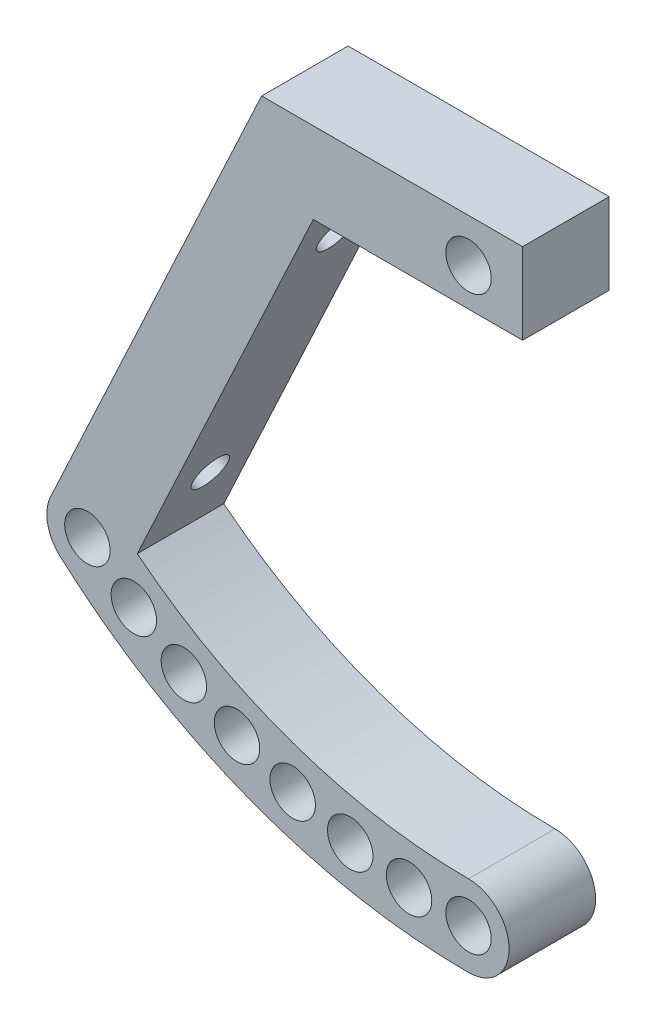
ISO-10303-21;
HEADER;
FILE_DESCRIPTION(('STEP AP214'),'2;1');
FILE_NAME('part.step','',(''),(''),'','','');
FILE_SCHEMA(('AUTOMOTIVE_DESIGN { 1 0 10303 214 1 1 1 1 }'));
ENDSEC;
DATA;
#1=APPLICATION_CONTEXT('core data for automotive mechanical design processes');
#2=APPLICATION_PROTOCOL_DEFINITION('international standard','automotive_design',2000,#1);
#3=PRODUCT_CONTEXT('',#1,'mechanical');
#4=PRODUCT('Part','Part','',(#3));
#5=PRODUCT_RELATED_PRODUCT_CATEGORY('part','',(#4));
#6=PRODUCT_DEFINITION_FORMATION('','',#4);
#7=PRODUCT_DEFINITION_CONTEXT('part definition',#1,'design');
#8=PRODUCT_DEFINITION('design','',#6,#7);
#9=PRODUCT_DEFINITION_SHAPE('','',#8);
#10=(LENGTH_UNIT() NAMED_UNIT(*) SI_UNIT(.MILLI.,.METRE.));
#11=(NAMED_UNIT(*) PLANE_ANGLE_UNIT() SI_UNIT($,.RADIAN.));
#12=(NAMED_UNIT(*) SI_UNIT($,.STERADIAN.) SOLID_ANGLE_UNIT());
#13=UNCERTAINTY_MEASURE_WITH_UNIT(LENGTH_MEASURE(1.E-05),#10,'distance_accuracy_value','');
#14=(GEOMETRIC_REPRESENTATION_CONTEXT(3) GLOBAL_UNCERTAINTY_ASSIGNED_CONTEXT((#13)) GLOBAL_UNIT_ASSIGNED_CONTEXT((#10,
#11,#12)) REPRESENTATION_CONTEXT('',''));
#15=CARTESIAN_POINT('',(0.,0.,0.));
#16=DIRECTION('',(0.,0.,1.));
#17=DIRECTION('',(1.,0.,0.));
#18=AXIS2_PLACEMENT_3D('',#15,#16,#17);
#19=CARTESIAN_POINT('',(-46.3566792332797,21.616474533113,8.));
#20=DIRECTION('',(0.906307787036651,-0.422618261740697,0.));
#21=DIRECTION('',(0.422618261740697,0.906307787036651,0.));
#22=AXIS2_PLACEMENT_3D('',#19,#20,#21);
#23=PLANE('',#22);
#24=CARTESIAN_POINT('',(-23.094691175394,71.5019689080599,4.));
#25=DIRECTION('',(-0.906307787036651,0.422618261740697,0.));
#26=DIRECTION('',(-0.422618261740697,-0.906307787036651,0.));
#27=AXIS2_PLACEMENT_3D('',#24,#25,#26);
#28=CIRCLE('',#27,1.65);
#29=CARTESIAN_POINT('',(-23.7920113072661,70.0065610594495,4.));
#30=VERTEX_POINT('',#29);
#31=EDGE_CURVE('E174',#30,#30,#28,.T.);
#32=ORIENTED_EDGE('',*,*,#31,.F.);
#33=EDGE_LOOP('',(#32));
#34=FACE_BOUND('',#33,.T.);
#35=CARTESIAN_POINT('',(-34.6744315470891,46.6691355432557,4.));
#36=DIRECTION('',(-0.906307787036651,0.422618261740697,0.));
#37=DIRECTION('',(-0.422618261740697,-0.906307787036651,0.));
#38=AXIS2_PLACEMENT_3D('',#35,#36,#37);
#39=CIRCLE('',#38,1.65);
#40=CARTESIAN_POINT('',(-35.3717516789612,45.1737276946452,4.));
#41=VERTEX_POINT('',#40);
#42=EDGE_CURVE('E257',#41,#41,#39,.T.);
#43=ORIENTED_EDGE('',*,*,#42,.F.);
#44=EDGE_LOOP('',(#43));
#45=FACE_BOUND('',#44,.T.);
#46=DIRECTION('',(-0.422618261740697,-0.906307787036651,0.));
#47=VECTOR('',#46,1.);
#48=CARTESIAN_POINT('',(-46.3566792332797,21.616474533113,0.));
#49=LINE('',#48,#47);
#50=CARTESIAN_POINT('',(-19.131994197983,80.,0.));
#51=VERTEX_POINT('',#50);
#52=CARTESIAN_POINT('',(-38.6371285245,38.1711044513156,0.));
#53=VERTEX_POINT('',#52);
#54=EDGE_CURVE('E173',#51,#53,#49,.T.);
#55=ORIENTED_EDGE('',*,*,#54,.T.);
#56=DIRECTION('',(0.,0.,-1.));
#57=VECTOR('',#56,1.);
#58=CARTESIAN_POINT('',(-38.6371285245,38.1711044513156,8.));
#59=LINE('',#58,#57);
#60=CARTESIAN_POINT('',(-38.6371285245,38.1711044513156,8.));
#61=VERTEX_POINT('',#60);
#62=EDGE_CURVE('E11',#61,#53,#59,.T.);
#63=ORIENTED_EDGE('',*,*,#62,.F.);
#64=DIRECTION('',(-0.422618261740697,-0.906307787036651,0.));
#65=VECTOR('',#64,1.);
#66=CARTESIAN_POINT('',(-46.3566792332797,21.616474533113,8.));
#67=LINE('',#66,#65);
#68=CARTESIAN_POINT('',(-19.131994197983,80.,8.));
#69=VERTEX_POINT('',#68);
#70=EDGE_CURVE('E250',#69,#61,#67,.T.);
#71=ORIENTED_EDGE('',*,*,#70,.F.);
#72=DIRECTION('',(0.,0.,-1.));
#73=VECTOR('',#72,1.);
#74=CARTESIAN_POINT('',(-19.131994197983,80.,8.));
#75=LINE('',#74,#73);
#76=EDGE_CURVE('E169',#69,#51,#75,.T.);
#77=ORIENTED_EDGE('',*,*,#76,.T.);
#78=EDGE_LOOP('',(#55,#63,#71,#77));
#79=FACE_BOUND('',#78,.T.);
#80=ADVANCED_FACE('F40',(#34,#45,#79),#23,.F.);
#81=CARTESIAN_POINT('',(-35.2384743231125,36.586285969788,8.));
#82=DIRECTION('',(0.,0.,-1.));
#83=DIRECTION('',(-1.,0.,0.));
#84=AXIS2_PLACEMENT_3D('',#81,#82,#83);
#85=CYLINDRICAL_SURFACE('',#84,3.75);
#86=CARTESIAN_POINT('',(-35.2384743231125,36.586285969788,0.));
#87=DIRECTION('',(0.,0.,1.));
#88=DIRECTION('',(1.,0.,0.));
#89=AXIS2_PLACEMENT_3D('',#86,#87,#88);
#90=CIRCLE('',#89,3.75);
#91=CARTESIAN_POINT('',(-37.7379138053234,33.7906997567076,0.));
#92=VERTEX_POINT('',#91);
#93=EDGE_CURVE('E177',#53,#92,#90,.T.);
#94=ORIENTED_EDGE('',*,*,#93,.T.);
#95=DIRECTION('',(0.,0.,-1.));
#96=VECTOR('',#95,1.);
#97=CARTESIAN_POINT('',(-37.7379138053234,33.7906997567076,8.));
#98=LINE('',#97,#96);
#99=CARTESIAN_POINT('',(-37.7379138053234,33.7906997567076,8.));
#100=VERTEX_POINT('',#99);
#101=EDGE_CURVE('E49',#100,#92,#98,.T.);
#102=ORIENTED_EDGE('',*,*,#101,.F.);
#103=CARTESIAN_POINT('',(-35.2384743231125,36.586285969788,8.));
#104=DIRECTION('',(0.,0.,1.));
#105=DIRECTION('',(1.,0.,0.));
#106=AXIS2_PLACEMENT_3D('',#103,#104,#105);
#107=CIRCLE('',#106,3.75);
#108=EDGE_CURVE('E102',#61,#100,#107,.T.);
#109=ORIENTED_EDGE('',*,*,#108,.F.);
#110=ORIENTED_EDGE('',*,*,#62,.T.);
#111=EDGE_LOOP('',(#94,#102,#109,#110));
#112=FACE_BOUND('',#111,.T.);
#113=ADVANCED_FACE('F270',(#112),#85,.T.);
#114=CARTESIAN_POINT('',(0.,76.,8.));
#115=DIRECTION('',(0.,0.,-1.));
#116=DIRECTION('',(-1.,0.,0.));
#117=AXIS2_PLACEMENT_3D('',#114,#115,#116);
#118=CYLINDRICAL_SURFACE('',#117,56.6195652173913);
#119=CARTESIAN_POINT('',(0.,76.,0.));
#120=DIRECTION('',(0.,0.,1.));
#121=DIRECTION('',(1.,0.,0.));
#122=AXIS2_PLACEMENT_3D('',#119,#120,#121);
#123=CIRCLE('',#122,56.6195652173913);
#124=CARTESIAN_POINT('',(-6.22100093414468E-13,19.3804347826087,0.));
#125=VERTEX_POINT('',#124);
#126=EDGE_CURVE('E179',#92,#125,#123,.T.);
#127=ORIENTED_EDGE('',*,*,#126,.T.);
#128=DIRECTION('',(0.,0.,-1.));
#129=VECTOR('',#128,1.);
#130=CARTESIAN_POINT('',(-6.22100093414468E-13,19.3804347826087,8.));
#131=LINE('',#130,#129);
#132=CARTESIAN_POINT('',(-6.22100093414468E-13,19.3804347826087,8.));
#133=VERTEX_POINT('',#132);
#134=EDGE_CURVE('E225',#133,#125,#131,.T.);
#135=ORIENTED_EDGE('',*,*,#134,.F.);
#136=CARTESIAN_POINT('',(0.,76.,8.));
#137=DIRECTION('',(0.,0.,1.));
#138=DIRECTION('',(1.,0.,0.));
#139=AXIS2_PLACEMENT_3D('',#136,#137,#138);
#140=CIRCLE('',#139,56.6195652173913);
#141=EDGE_CURVE('E233',#100,#133,#140,.T.);
#142=ORIENTED_EDGE('',*,*,#141,.F.);
#143=ORIENTED_EDGE('',*,*,#101,.T.);
#144=EDGE_LOOP('',(#127,#135,#142,#143));
#145=FACE_BOUND('',#144,.T.);
#146=ADVANCED_FACE('F231',(#145),#118,.T.);
#147=CARTESIAN_POINT('',(-5.50774703622636E-13,23.1304347826087,8.));
#148=DIRECTION('',(0.,0.,-1.));
#149=DIRECTION('',(-1.,0.,0.));
#150=AXIS2_PLACEMENT_3D('',#147,#148,#149);
#151=CYLINDRICAL_SURFACE('',#150,3.74999999999999);
#152=CARTESIAN_POINT('',(-5.50774703622636E-13,23.1304347826087,0.));
#153=DIRECTION('',(0.,0.,1.));
#154=DIRECTION('',(1.,0.,0.));
#155=AXIS2_PLACEMENT_3D('',#152,#153,#154);
#156=CIRCLE('',#155,3.74999999999999);
#157=CARTESIAN_POINT('',(-5.40786307992416E-13,26.8804347826087,0.));
#158=VERTEX_POINT('',#157);
#159=EDGE_CURVE('E181',#125,#158,#156,.T.);
#160=ORIENTED_EDGE('',*,*,#159,.T.);
#161=DIRECTION('',(0.,0.,-1.));
#162=VECTOR('',#161,1.);
#163=CARTESIAN_POINT('',(-5.40786307992416E-13,26.8804347826087,8.));
#164=LINE('',#163,#162);
#165=CARTESIAN_POINT('',(-5.40786307992416E-13,26.8804347826087,8.));
#166=VERTEX_POINT('',#165);
#167=EDGE_CURVE('E223',#166,#158,#164,.T.);
#168=ORIENTED_EDGE('',*,*,#167,.F.);
#169=CARTESIAN_POINT('',(-5.50774703622636E-13,23.1304347826087,8.));
#170=DIRECTION('',(0.,0.,1.));
#171=DIRECTION('',(1.,0.,0.));
#172=AXIS2_PLACEMENT_3D('',#169,#170,#171);
#173=CIRCLE('',#172,3.74999999999999);
#174=EDGE_CURVE('E245',#133,#166,#173,.T.);
#175=ORIENTED_EDGE('',*,*,#174,.F.);
#176=ORIENTED_EDGE('',*,*,#134,.T.);
#177=EDGE_LOOP('',(#160,#168,#175,#176));
#178=FACE_BOUND('',#177,.T.);
#179=ADVANCED_FACE('F242',(#178),#151,.T.);
#180=CARTESIAN_POINT('',(0.,76.,8.));
#181=DIRECTION('',(0.,0.,-1.));
#182=DIRECTION('',(-1.,0.,0.));
#183=AXIS2_PLACEMENT_3D('',#180,#181,#182);
#184=CYLINDRICAL_SURFACE('',#183,49.1195652173913);
#185=CARTESIAN_POINT('',(0.,76.,0.));
#186=DIRECTION('',(0.,0.,1.));
#187=DIRECTION('',(1.,0.,0.));
#188=AXIS2_PLACEMENT_3D('',#185,#186,#187);
#189=CIRCLE('',#188,49.1195652173913);
#190=CARTESIAN_POINT('',(-30.6285068063964,37.5991372758881,0.));
#191=VERTEX_POINT('',#190);
#192=EDGE_CURVE('E184',#191,#158,#189,.T.);
#193=ORIENTED_EDGE('',*,*,#192,.F.);
#194=DIRECTION('',(0.,0.,-1.));
#195=VECTOR('',#194,1.);
#196=CARTESIAN_POINT('',(-30.6285068063964,37.5991372758881,8.));
#197=LINE('',#196,#195);
#198=CARTESIAN_POINT('',(-30.6285068063964,37.5991372758881,8.));
#199=VERTEX_POINT('',#198);
#200=EDGE_CURVE('E221',#199,#191,#197,.T.);
#201=ORIENTED_EDGE('',*,*,#200,.F.);
#202=CARTESIAN_POINT('',(0.,76.,8.));
#203=DIRECTION('',(0.,0.,1.));
#204=DIRECTION('',(1.,0.,0.));
#205=AXIS2_PLACEMENT_3D('',#202,#203,#204);
#206=CIRCLE('',#205,49.1195652173913);
#207=EDGE_CURVE('E140',#199,#166,#206,.T.);
#208=ORIENTED_EDGE('',*,*,#207,.T.);
#209=ORIENTED_EDGE('',*,*,#167,.T.);
#210=EDGE_LOOP('',(#193,#201,#208,#209));
#211=FACE_BOUND('',#210,.T.);
#212=ADVANCED_FACE('F279',(#211),#184,.F.);
#213=CARTESIAN_POINT('',(-39.5593708305048,18.4468375700577,8.));
#214=DIRECTION('',(0.906307787036651,-0.422618261740697,0.));
#215=DIRECTION('',(0.422618261740697,0.906307787036651,0.));
#216=AXIS2_PLACEMENT_3D('',#213,#214,#215);
#217=PLANE('',#216);
#218=CARTESIAN_POINT('',(-16.2973827726191,68.3323319450047,4.));
#219=DIRECTION('',(0.906307787036651,-0.422618261740697,0.));
#220=DIRECTION('',(0.422618261740697,0.906307787036651,0.));
#221=AXIS2_PLACEMENT_3D('',#218,#219,#220);
#222=CIRCLE('',#221,1.65);
#223=CARTESIAN_POINT('',(-15.6000626407469,69.8277397936152,4.));
#224=VERTEX_POINT('',#223);
#225=EDGE_CURVE('E260',#224,#224,#222,.F.);
#226=ORIENTED_EDGE('',*,*,#225,.T.);
#227=EDGE_LOOP('',(#226));
#228=FACE_BOUND('',#227,.T.);
#229=CARTESIAN_POINT('',(-27.8771231443142,43.4994985802004,4.));
#230=DIRECTION('',(0.906307787036651,-0.422618261740697,0.));
#231=DIRECTION('',(0.422618261740697,0.906307787036651,0.));
#232=AXIS2_PLACEMENT_3D('',#229,#230,#231);
#233=CIRCLE('',#232,1.65);
#234=CARTESIAN_POINT('',(-27.179803012442,44.9949064288109,4.));
#235=VERTEX_POINT('',#234);
#236=EDGE_CURVE('E254',#235,#235,#233,.F.);
#237=ORIENTED_EDGE('',*,*,#236,.T.);
#238=EDGE_LOOP('',(#237));
#239=FACE_BOUND('',#238,.T.);
#240=DIRECTION('',(-0.422618261740697,-0.906307787036651,0.));
#241=VECTOR('',#240,1.);
#242=CARTESIAN_POINT('',(-39.5593708305048,18.4468375700577,0.));
#243=LINE('',#242,#241);
#244=CARTESIAN_POINT('',(-14.3539672419268,72.5,0.));
#245=VERTEX_POINT('',#244);
#246=EDGE_CURVE('E187',#245,#191,#243,.T.);
#247=ORIENTED_EDGE('',*,*,#246,.F.);
#248=DIRECTION('',(0.,0.,-1.));
#249=VECTOR('',#248,1.);
#250=CARTESIAN_POINT('',(-14.3539672419268,72.5,8.));
#251=LINE('',#250,#249);
#252=CARTESIAN_POINT('',(-14.3539672419268,72.5,8.));
#253=VERTEX_POINT('',#252);
#254=EDGE_CURVE('E127',#253,#245,#251,.T.);
#255=ORIENTED_EDGE('',*,*,#254,.F.);
#256=DIRECTION('',(-0.422618261740697,-0.906307787036651,0.));
#257=VECTOR('',#256,1.);
#258=CARTESIAN_POINT('',(-39.5593708305048,18.4468375700577,8.));
#259=LINE('',#258,#257);
#260=EDGE_CURVE('E138',#253,#199,#259,.T.);
#261=ORIENTED_EDGE('',*,*,#260,.T.);
#262=ORIENTED_EDGE('',*,*,#200,.T.);
#263=EDGE_LOOP('',(#247,#255,#261,#262));
#264=FACE_BOUND('',#263,.T.);
#265=ADVANCED_FACE('F277',(#228,#239,#264),#217,.T.);
#266=CARTESIAN_POINT('',(0.,72.5,8.));
#267=DIRECTION('',(0.,-1.,0.));
#268=DIRECTION('',(0.,0.,-1.));
#269=AXIS2_PLACEMENT_3D('',#266,#267,#268);
#270=PLANE('',#269);
#271=DIRECTION('',(-1.,0.,0.));
#272=VECTOR('',#271,1.);
#273=CARTESIAN_POINT('',(0.,72.5,0.));
#274=LINE('',#273,#272);
#275=CARTESIAN_POINT('',(5.00000000000002,72.5,0.));
#276=VERTEX_POINT('',#275);
#277=EDGE_CURVE('E126',#276,#245,#274,.T.);
#278=ORIENTED_EDGE('',*,*,#277,.F.);
#279=DIRECTION('',(0.,0.,-1.));
#280=VECTOR('',#279,1.);
#281=CARTESIAN_POINT('',(5.00000000000002,72.5,8.));
#282=LINE('',#281,#280);
#283=CARTESIAN_POINT('',(5.00000000000002,72.5,8.));
#284=VERTEX_POINT('',#283);
#285=EDGE_CURVE('E120',#284,#276,#282,.T.);
#286=ORIENTED_EDGE('',*,*,#285,.F.);
#287=DIRECTION('',(-1.,0.,0.));
#288=VECTOR('',#287,1.);
#289=CARTESIAN_POINT('',(0.,72.5,8.));
#290=LINE('',#289,#288);
#291=EDGE_CURVE('E124',#284,#253,#290,.T.);
#292=ORIENTED_EDGE('',*,*,#291,.T.);
#293=ORIENTED_EDGE('',*,*,#254,.T.);
#294=EDGE_LOOP('',(#278,#286,#292,#293));
#295=FACE_BOUND('',#294,.T.);
#296=ADVANCED_FACE('F122',(#295),#270,.T.);
#297=CARTESIAN_POINT('',(5.00000000000004,0.,8.));
#298=DIRECTION('',(-1.,0.,0.));
#299=DIRECTION('',(0.,-1.,0.));
#300=AXIS2_PLACEMENT_3D('',#297,#298,#299);
#301=PLANE('',#300);
#302=DIRECTION('',(0.,1.,0.));
#303=VECTOR('',#302,1.);
#304=CARTESIAN_POINT('',(5.00000000000004,0.,0.));
#305=LINE('',#304,#303);
#306=CARTESIAN_POINT('',(5.00000000000002,80.,0.));
#307=VERTEX_POINT('',#306);
#308=EDGE_CURVE('E88',#276,#307,#305,.T.);
#309=ORIENTED_EDGE('',*,*,#308,.T.);
#310=DIRECTION('',(0.,0.,-1.));
#311=VECTOR('',#310,1.);
#312=CARTESIAN_POINT('',(5.00000000000002,80.,8.));
#313=LINE('',#312,#311);
#314=CARTESIAN_POINT('',(5.00000000000002,80.,8.));
#315=VERTEX_POINT('',#314);
#316=EDGE_CURVE('E128',#315,#307,#313,.T.);
#317=ORIENTED_EDGE('',*,*,#316,.F.);
#318=DIRECTION('',(0.,1.,0.));
#319=VECTOR('',#318,1.);
#320=CARTESIAN_POINT('',(5.00000000000004,0.,8.));
#321=LINE('',#320,#319);
#322=EDGE_CURVE('E130',#284,#315,#321,.T.);
#323=ORIENTED_EDGE('',*,*,#322,.F.);
#324=ORIENTED_EDGE('',*,*,#285,.T.);
#325=EDGE_LOOP('',(#309,#317,#323,#324));
#326=FACE_BOUND('',#325,.T.);
#327=ADVANCED_FACE('F131',(#326),#301,.F.);
#328=CARTESIAN_POINT('',(-5.5,23.4172944184498,8.));
#329=DIRECTION('',(0.,0.,-1.));
#330=DIRECTION('',(-1.,0.,0.));
#331=AXIS2_PLACEMENT_3D('',#328,#329,#330);
#332=CYLINDRICAL_SURFACE('',#331,2.1);
#333=CARTESIAN_POINT('',(-5.5,23.4172944184498,8.));
#334=DIRECTION('',(0.,0.,1.));
#335=DIRECTION('',(1.,0.,0.));
#336=AXIS2_PLACEMENT_3D('',#333,#334,#335);
#337=CIRCLE('',#336,2.1);
#338=CARTESIAN_POINT('',(-3.39999999999999,23.4172944184498,8.));
#339=VERTEX_POINT('',#338);
#340=EDGE_CURVE('E163',#339,#339,#337,.T.);
#341=ORIENTED_EDGE('',*,*,#340,.T.);
#342=EDGE_LOOP('',(#341));
#343=FACE_BOUND('',#342,.T.);
#344=CARTESIAN_POINT('',(-5.5,23.4172944184498,0.));
#345=DIRECTION('',(0.,0.,1.));
#346=DIRECTION('',(1.,0.,0.));
#347=AXIS2_PLACEMENT_3D('',#344,#345,#346);
#348=CIRCLE('',#347,2.1);
#349=CARTESIAN_POINT('',(-3.39999999999999,23.4172944184498,0.));
#350=VERTEX_POINT('',#349);
#351=EDGE_CURVE('E211',#350,#350,#348,.T.);
#352=ORIENTED_EDGE('',*,*,#351,.F.);
#353=EDGE_LOOP('',(#352));
#354=FACE_BOUND('',#353,.T.);
#355=ADVANCED_FACE('F327',(#343,#354),#332,.F.);
#356=CARTESIAN_POINT('',(-10.940316210635,24.2747604405034,8.));
#357=DIRECTION('',(0.,0.,-1.));
#358=DIRECTION('',(-1.,0.,0.));
#359=AXIS2_PLACEMENT_3D('',#356,#357,#358);
#360=CYLINDRICAL_SURFACE('',#359,2.1);
#361=CARTESIAN_POINT('',(-10.940316210635,24.2747604405034,8.));
#362=DIRECTION('',(0.,0.,1.));
#363=DIRECTION('',(1.,0.,0.));
#364=AXIS2_PLACEMENT_3D('',#361,#362,#363);
#365=CIRCLE('',#364,2.1);
#366=CARTESIAN_POINT('',(-8.84031621063503,24.2747604405034,8.));
#367=VERTEX_POINT('',#366);
#368=EDGE_CURVE('E160',#367,#367,#365,.T.);
#369=ORIENTED_EDGE('',*,*,#368,.T.);
#370=EDGE_LOOP('',(#369));
#371=FACE_BOUND('',#370,.T.);
#372=CARTESIAN_POINT('',(-10.940316210635,24.2747604405034,0.));
#373=DIRECTION('',(0.,0.,1.));
#374=DIRECTION('',(1.,0.,0.));
#375=AXIS2_PLACEMENT_3D('',#372,#373,#374);
#376=CIRCLE('',#375,2.1);
#377=CARTESIAN_POINT('',(-8.84031621063503,24.2747604405034,0.));
#378=VERTEX_POINT('',#377);
#379=EDGE_CURVE('E208',#378,#378,#376,.T.);
#380=ORIENTED_EDGE('',*,*,#379,.F.);
#381=EDGE_LOOP('',(#380));
#382=FACE_BOUND('',#381,.T.);
#383=ADVANCED_FACE('F336',(#371,#382),#360,.F.);
#384=CARTESIAN_POINT('',(-16.2619125070334,25.6935279721428,8.));
#385=DIRECTION('',(0.,0.,-1.));
#386=DIRECTION('',(-1.,0.,0.));
#387=AXIS2_PLACEMENT_3D('',#384,#385,#386);
#388=CYLINDRICAL_SURFACE('',#387,2.1);
#389=CARTESIAN_POINT('',(-16.2619125070334,25.6935279721428,8.));
#390=DIRECTION('',(0.,0.,1.));
#391=DIRECTION('',(1.,0.,0.));
#392=AXIS2_PLACEMENT_3D('',#389,#390,#391);
#393=CIRCLE('',#392,2.1);
#394=CARTESIAN_POINT('',(-14.1619125070334,25.6935279721428,8.));
#395=VERTEX_POINT('',#394);
#396=EDGE_CURVE('E157',#395,#395,#393,.T.);
#397=ORIENTED_EDGE('',*,*,#396,.T.);
#398=EDGE_LOOP('',(#397));
#399=FACE_BOUND('',#398,.T.);
#400=CARTESIAN_POINT('',(-16.2619125070334,25.6935279721428,0.));
#401=DIRECTION('',(0.,0.,1.));
#402=DIRECTION('',(1.,0.,0.));
#403=AXIS2_PLACEMENT_3D('',#400,#401,#402);
#404=CIRCLE('',#403,2.1);
#405=CARTESIAN_POINT('',(-14.1619125070334,25.6935279721428,0.));
#406=VERTEX_POINT('',#405);
#407=EDGE_CURVE('E205',#406,#406,#404,.T.);
#408=ORIENTED_EDGE('',*,*,#407,.F.);
#409=EDGE_LOOP('',(#408));
#410=FACE_BOUND('',#409,.T.);
#411=ADVANCED_FACE('F346',(#399,#410),#388,.F.);
#412=CARTESIAN_POINT('',(-21.4070410651152,27.6582011183648,8.));
#413=DIRECTION('',(0.,0.,-1.));
#414=DIRECTION('',(-1.,0.,0.));
#415=AXIS2_PLACEMENT_3D('',#412,#413,#414);
#416=CYLINDRICAL_SURFACE('',#415,2.1);
#417=CARTESIAN_POINT('',(-21.4070410651152,27.6582011183648,8.));
#418=DIRECTION('',(0.,0.,1.));
#419=DIRECTION('',(1.,0.,0.));
#420=AXIS2_PLACEMENT_3D('',#417,#418,#419);
#421=CIRCLE('',#420,2.1);
#422=CARTESIAN_POINT('',(-19.3070410651152,27.6582011183648,8.));
#423=VERTEX_POINT('',#422);
#424=EDGE_CURVE('E154',#423,#423,#421,.T.);
#425=ORIENTED_EDGE('',*,*,#424,.T.);
#426=EDGE_LOOP('',(#425));
#427=FACE_BOUND('',#426,.T.);
#428=CARTESIAN_POINT('',(-21.4070410651152,27.6582011183648,0.));
#429=DIRECTION('',(0.,0.,1.));
#430=DIRECTION('',(1.,0.,0.));
#431=AXIS2_PLACEMENT_3D('',#428,#429,#430);
#432=CIRCLE('',#431,2.1);
#433=CARTESIAN_POINT('',(-19.3070410651152,27.6582011183648,0.));
#434=VERTEX_POINT('',#433);
#435=EDGE_CURVE('E202',#434,#434,#432,.T.);
#436=ORIENTED_EDGE('',*,*,#435,.F.);
#437=EDGE_LOOP('',(#436));
#438=FACE_BOUND('',#437,.T.);
#439=ADVANCED_FACE('F356',(#427,#438),#416,.F.);
#440=CARTESIAN_POINT('',(-26.3198690177684,30.1474600358551,8.));
#441=DIRECTION('',(0.,0.,-1.));
#442=DIRECTION('',(-1.,0.,0.));
#443=AXIS2_PLACEMENT_3D('',#440,#441,#442);
#444=CYLINDRICAL_SURFACE('',#443,2.10000000000001);
#445=CARTESIAN_POINT('',(-26.3198690177684,30.1474600358551,8.));
#446=DIRECTION('',(0.,0.,1.));
#447=DIRECTION('',(1.,0.,0.));
#448=AXIS2_PLACEMENT_3D('',#445,#446,#447);
#449=CIRCLE('',#448,2.10000000000001);
#450=CARTESIAN_POINT('',(-24.2198690177684,30.1474600358551,8.));
#451=VERTEX_POINT('',#450);
#452=EDGE_CURVE('E151',#451,#451,#449,.T.);
#453=ORIENTED_EDGE('',*,*,#452,.T.);
#454=EDGE_LOOP('',(#453));
#455=FACE_BOUND('',#454,.T.);
#456=CARTESIAN_POINT('',(-26.3198690177684,30.1474600358551,0.));
#457=DIRECTION('',(0.,0.,1.));
#458=DIRECTION('',(1.,0.,0.));
#459=AXIS2_PLACEMENT_3D('',#456,#457,#458);
#460=CIRCLE('',#459,2.10000000000001);
#461=CARTESIAN_POINT('',(-24.2198690177684,30.1474600358551,0.));
#462=VERTEX_POINT('',#461);
#463=EDGE_CURVE('E199',#462,#462,#460,.T.);
#464=ORIENTED_EDGE('',*,*,#463,.F.);
#465=EDGE_LOOP('',(#464));
#466=FACE_BOUND('',#465,.T.);
#467=ADVANCED_FACE('F366',(#455,#466),#444,.F.);
#468=CARTESIAN_POINT('',(-35.2384743231125,36.586285969788,8.));
#469=DIRECTION('',(0.,0.,-1.));
#470=DIRECTION('',(-1.,0.,0.));
#471=AXIS2_PLACEMENT_3D('',#468,#469,#470);
#472=CYLINDRICAL_SURFACE('',#471,2.1);
#473=CARTESIAN_POINT('',(-35.2384743231125,36.586285969788,8.));
#474=DIRECTION('',(0.,0.,1.));
#475=DIRECTION('',(1.,0.,0.));
#476=AXIS2_PLACEMENT_3D('',#473,#474,#475);
#477=CIRCLE('',#476,2.1);
#478=CARTESIAN_POINT('',(-33.1384743231125,36.586285969788,8.));
#479=VERTEX_POINT('',#478);
#480=EDGE_CURVE('E148',#479,#479,#477,.T.);
#481=ORIENTED_EDGE('',*,*,#480,.T.);
#482=EDGE_LOOP('',(#481));
#483=FACE_BOUND('',#482,.T.);
#484=CARTESIAN_POINT('',(-35.2384743231125,36.586285969788,0.));
#485=DIRECTION('',(0.,0.,1.));
#486=DIRECTION('',(1.,0.,0.));
#487=AXIS2_PLACEMENT_3D('',#484,#485,#486);
#488=CIRCLE('',#487,2.1);
#489=CARTESIAN_POINT('',(-33.1384743231125,36.586285969788,0.));
#490=VERTEX_POINT('',#489);
#491=EDGE_CURVE('E196',#490,#490,#488,.T.);
#492=ORIENTED_EDGE('',*,*,#491,.F.);
#493=EDGE_LOOP('',(#492));
#494=FACE_BOUND('',#493,.T.);
#495=ADVANCED_FACE('F376',(#483,#494),#472,.F.);
#496=CARTESIAN_POINT('',(0.,76.,8.));
#497=DIRECTION('',(0.,0.,-1.));
#498=DIRECTION('',(-1.,0.,0.));
#499=AXIS2_PLACEMENT_3D('',#496,#497,#498);
#500=CYLINDRICAL_SURFACE('',#499,2.09999999999985);
#501=CARTESIAN_POINT('',(0.,76.,8.));
#502=DIRECTION('',(0.,0.,1.));
#503=DIRECTION('',(1.,0.,0.));
#504=AXIS2_PLACEMENT_3D('',#501,#502,#503);
#505=CIRCLE('',#504,2.09999999999985);
#506=CARTESIAN_POINT('',(2.09999999999985,76.,8.));
#507=VERTEX_POINT('',#506);
#508=EDGE_CURVE('E145',#507,#507,#505,.T.);
#509=ORIENTED_EDGE('',*,*,#508,.T.);
#510=EDGE_LOOP('',(#509));
#511=FACE_BOUND('',#510,.T.);
#512=CARTESIAN_POINT('',(0.,76.,0.));
#513=DIRECTION('',(0.,0.,1.));
#514=DIRECTION('',(1.,0.,0.));
#515=AXIS2_PLACEMENT_3D('',#512,#513,#514);
#516=CIRCLE('',#515,2.09999999999985);
#517=CARTESIAN_POINT('',(2.09999999999985,76.,0.));
#518=VERTEX_POINT('',#517);
#519=EDGE_CURVE('E193',#518,#518,#516,.T.);
#520=ORIENTED_EDGE('',*,*,#519,.F.);
#521=EDGE_LOOP('',(#520));
#522=FACE_BOUND('',#521,.T.);
#523=ADVANCED_FACE('F386',(#511,#522),#500,.F.);
#524=CARTESIAN_POINT('',(0.,80.,8.));
#525=DIRECTION('',(0.,-1.,0.));
#526=DIRECTION('',(0.,0.,-1.));
#527=AXIS2_PLACEMENT_3D('',#524,#525,#526);
#528=PLANE('',#527);
#529=DIRECTION('',(-1.,0.,0.));
#530=VECTOR('',#529,1.);
#531=CARTESIAN_POINT('',(0.,80.,0.));
#532=LINE('',#531,#530);
#533=EDGE_CURVE('E94',#307,#51,#532,.T.);
#534=ORIENTED_EDGE('',*,*,#533,.T.);
#535=ORIENTED_EDGE('',*,*,#76,.F.);
#536=DIRECTION('',(-1.,0.,0.));
#537=VECTOR('',#536,1.);
#538=CARTESIAN_POINT('',(0.,80.,8.));
#539=LINE('',#538,#537);
#540=EDGE_CURVE('E57',#315,#69,#539,.T.);
#541=ORIENTED_EDGE('',*,*,#540,.F.);
#542=ORIENTED_EDGE('',*,*,#316,.T.);
#543=EDGE_LOOP('',(#534,#535,#541,#542));
#544=FACE_BOUND('',#543,.T.);
#545=ADVANCED_FACE('F396',(#544),#528,.F.);
#546=CARTESIAN_POINT('',(-30.9470843306816,33.1342922873577,8.));
#547=DIRECTION('',(0.,0.,-1.));
#548=DIRECTION('',(-1.,0.,0.));
#549=AXIS2_PLACEMENT_3D('',#546,#547,#548);
#550=CYLINDRICAL_SURFACE('',#549,2.10000000000002);
#551=CARTESIAN_POINT('',(-30.9470843306816,33.1342922873577,8.));
#552=DIRECTION('',(0.,0.,1.));
#553=DIRECTION('',(1.,0.,0.));
#554=AXIS2_PLACEMENT_3D('',#551,#552,#553);
#555=CIRCLE('',#554,2.10000000000002);
#556=CARTESIAN_POINT('',(-28.8470843306815,33.1342922873577,8.));
#557=VERTEX_POINT('',#556);
#558=EDGE_CURVE('E217',#557,#557,#555,.T.);
#559=ORIENTED_EDGE('',*,*,#558,.T.);
#560=EDGE_LOOP('',(#559));
#561=FACE_BOUND('',#560,.T.);
#562=CARTESIAN_POINT('',(-30.9470843306816,33.1342922873577,0.));
#563=DIRECTION('',(0.,0.,1.));
#564=DIRECTION('',(1.,0.,0.));
#565=AXIS2_PLACEMENT_3D('',#562,#563,#564);
#566=CIRCLE('',#565,2.10000000000002);
#567=CARTESIAN_POINT('',(-28.8470843306815,33.1342922873577,0.));
#568=VERTEX_POINT('',#567);
#569=EDGE_CURVE('E170',#568,#568,#566,.T.);
#570=ORIENTED_EDGE('',*,*,#569,.F.);
#571=EDGE_LOOP('',(#570));
#572=FACE_BOUND('',#571,.T.);
#573=ADVANCED_FACE('F42',(#561,#572),#550,.F.);
#574=CARTESIAN_POINT('',(-5.50774703622636E-13,23.1304347826087,8.));
#575=DIRECTION('',(0.,0.,-1.));
#576=DIRECTION('',(-1.,0.,0.));
#577=AXIS2_PLACEMENT_3D('',#574,#575,#576);
#578=CYLINDRICAL_SURFACE('',#577,2.10000000000001);
#579=CARTESIAN_POINT('',(-5.50774703622636E-13,23.1304347826087,8.));
#580=DIRECTION('',(0.,0.,1.));
#581=DIRECTION('',(1.,0.,0.));
#582=AXIS2_PLACEMENT_3D('',#579,#580,#581);
#583=CIRCLE('',#582,2.10000000000001);
#584=CARTESIAN_POINT('',(2.09999999999945,23.1304347826087,8.));
#585=VERTEX_POINT('',#584);
#586=EDGE_CURVE('E166',#585,#585,#583,.T.);
#587=ORIENTED_EDGE('',*,*,#586,.T.);
#588=EDGE_LOOP('',(#587));
#589=FACE_BOUND('',#588,.T.);
#590=CARTESIAN_POINT('',(-5.50774703622636E-13,23.1304347826087,0.));
#591=DIRECTION('',(0.,0.,1.));
#592=DIRECTION('',(1.,0.,0.));
#593=AXIS2_PLACEMENT_3D('',#590,#591,#592);
#594=CIRCLE('',#593,2.10000000000001);
#595=CARTESIAN_POINT('',(2.09999999999945,23.1304347826087,0.));
#596=VERTEX_POINT('',#595);
#597=EDGE_CURVE('E214',#596,#596,#594,.T.);
#598=ORIENTED_EDGE('',*,*,#597,.F.);
#599=EDGE_LOOP('',(#598));
#600=FACE_BOUND('',#599,.T.);
#601=ADVANCED_FACE('F414',(#589,#600),#578,.F.);
#602=CARTESIAN_POINT('',(0.,0.,8.));
#603=DIRECTION('',(0.,0.,1.));
#604=DIRECTION('',(1.,0.,0.));
#605=AXIS2_PLACEMENT_3D('',#602,#603,#604);
#606=PLANE('',#605);
#607=ORIENTED_EDGE('',*,*,#558,.F.);
#608=EDGE_LOOP('',(#607));
#609=FACE_BOUND('',#608,.T.);
#610=ORIENTED_EDGE('',*,*,#70,.T.);
#611=ORIENTED_EDGE('',*,*,#108,.T.);
#612=ORIENTED_EDGE('',*,*,#141,.T.);
#613=ORIENTED_EDGE('',*,*,#174,.T.);
#614=ORIENTED_EDGE('',*,*,#207,.F.);
#615=ORIENTED_EDGE('',*,*,#260,.F.);
#616=ORIENTED_EDGE('',*,*,#291,.F.);
#617=ORIENTED_EDGE('',*,*,#322,.T.);
#618=ORIENTED_EDGE('',*,*,#540,.T.);
#619=EDGE_LOOP('',(#610,#611,#612,#613,#614,#615,#616,#617,#618));
#620=FACE_BOUND('',#619,.T.);
#621=ORIENTED_EDGE('',*,*,#508,.F.);
#622=EDGE_LOOP('',(#621));
#623=FACE_BOUND('',#622,.T.);
#624=ORIENTED_EDGE('',*,*,#480,.F.);
#625=EDGE_LOOP('',(#624));
#626=FACE_BOUND('',#625,.T.);
#627=ORIENTED_EDGE('',*,*,#452,.F.);
#628=EDGE_LOOP('',(#627));
#629=FACE_BOUND('',#628,.T.);
#630=ORIENTED_EDGE('',*,*,#424,.F.);
#631=EDGE_LOOP('',(#630));
#632=FACE_BOUND('',#631,.T.);
#633=ORIENTED_EDGE('',*,*,#396,.F.);
#634=EDGE_LOOP('',(#633));
#635=FACE_BOUND('',#634,.T.);
#636=ORIENTED_EDGE('',*,*,#368,.F.);
#637=EDGE_LOOP('',(#636));
#638=FACE_BOUND('',#637,.T.);
#639=ORIENTED_EDGE('',*,*,#340,.F.);
#640=EDGE_LOOP('',(#639));
#641=FACE_BOUND('',#640,.T.);
#642=ORIENTED_EDGE('',*,*,#586,.F.);
#643=EDGE_LOOP('',(#642));
#644=FACE_BOUND('',#643,.T.);
#645=ADVANCED_FACE('F134',(#609,#620,#623,#626,#629,#632,#635,#638,#641,#644),#606,.T.);
#646=CARTESIAN_POINT('',(0.,0.,0.));
#647=DIRECTION('',(0.,0.,1.));
#648=DIRECTION('',(1.,0.,0.));
#649=AXIS2_PLACEMENT_3D('',#646,#647,#648);
#650=PLANE('',#649);
#651=ORIENTED_EDGE('',*,*,#569,.T.);
#652=EDGE_LOOP('',(#651));
#653=FACE_BOUND('',#652,.T.);
#654=ORIENTED_EDGE('',*,*,#54,.F.);
#655=ORIENTED_EDGE('',*,*,#533,.F.);
#656=ORIENTED_EDGE('',*,*,#308,.F.);
#657=ORIENTED_EDGE('',*,*,#277,.T.);
#658=ORIENTED_EDGE('',*,*,#246,.T.);
#659=ORIENTED_EDGE('',*,*,#192,.T.);
#660=ORIENTED_EDGE('',*,*,#159,.F.);
#661=ORIENTED_EDGE('',*,*,#126,.F.);
#662=ORIENTED_EDGE('',*,*,#93,.F.);
#663=EDGE_LOOP('',(#654,#655,#656,#657,#658,#659,#660,#661,#662));
#664=FACE_BOUND('',#663,.T.);
#665=ORIENTED_EDGE('',*,*,#519,.T.);
#666=EDGE_LOOP('',(#665));
#667=FACE_BOUND('',#666,.T.);
#668=ORIENTED_EDGE('',*,*,#491,.T.);
#669=EDGE_LOOP('',(#668));
#670=FACE_BOUND('',#669,.T.);
#671=ORIENTED_EDGE('',*,*,#463,.T.);
#672=EDGE_LOOP('',(#671));
#673=FACE_BOUND('',#672,.T.);
#674=ORIENTED_EDGE('',*,*,#435,.T.);
#675=EDGE_LOOP('',(#674));
#676=FACE_BOUND('',#675,.T.);
#677=ORIENTED_EDGE('',*,*,#407,.T.);
#678=EDGE_LOOP('',(#677));
#679=FACE_BOUND('',#678,.T.);
#680=ORIENTED_EDGE('',*,*,#379,.T.);
#681=EDGE_LOOP('',(#680));
#682=FACE_BOUND('',#681,.T.);
#683=ORIENTED_EDGE('',*,*,#351,.T.);
#684=EDGE_LOOP('',(#683));
#685=FACE_BOUND('',#684,.T.);
#686=ORIENTED_EDGE('',*,*,#597,.T.);
#687=EDGE_LOOP('',(#686));
#688=FACE_BOUND('',#687,.T.);
#689=ADVANCED_FACE('F237',(#653,#664,#667,#670,#673,#676,#679,#682,#685,#688),#650,.F.);
#690=CARTESIAN_POINT('',(8.36728394120986,26.5984539909334,4.));
#691=DIRECTION('',(-0.906307787036651,0.422618261740697,0.));
#692=DIRECTION('',(-0.422618261740697,-0.906307787036651,0.));
#693=AXIS2_PLACEMENT_3D('',#690,#691,#692);
#694=CYLINDRICAL_SURFACE('',#693,1.65);
#695=ORIENTED_EDGE('',*,*,#236,.F.);
#696=EDGE_LOOP('',(#695));
#697=FACE_BOUND('',#696,.T.);
#698=ORIENTED_EDGE('',*,*,#42,.T.);
#699=EDGE_LOOP('',(#698));
#700=FACE_BOUND('',#699,.T.);
#701=ADVANCED_FACE('F443',(#697,#700),#694,.F.);
#702=CARTESIAN_POINT('',(19.947024312905,51.4312873557376,4.));
#703=DIRECTION('',(-0.906307787036651,0.422618261740697,0.));
#704=DIRECTION('',(-0.422618261740697,-0.906307787036651,0.));
#705=AXIS2_PLACEMENT_3D('',#702,#703,#704);
#706=CYLINDRICAL_SURFACE('',#705,1.65);
#707=ORIENTED_EDGE('',*,*,#225,.F.);
#708=EDGE_LOOP('',(#707));
#709=FACE_BOUND('',#708,.T.);
#710=ORIENTED_EDGE('',*,*,#31,.T.);
#711=EDGE_LOOP('',(#710));
#712=FACE_BOUND('',#711,.T.);
#713=ADVANCED_FACE('F266',(#709,#712),#706,.F.);
#714=CLOSED_SHELL('',(#80,#113,#146,#179,#212,#265,#296,#327,#355,#383,#411,#439,#467,#495,#523,
#545,#573,#601,#645,#689,#701,#713));
#715=MANIFOLD_SOLID_BREP('B2',#714);
#716=ADVANCED_BREP_SHAPE_REPRESENTATION('',(#18,#715),#14);
#717=SHAPE_DEFINITION_REPRESENTATION(#9,#716);
ENDSEC;
END-ISO-10303-21;
